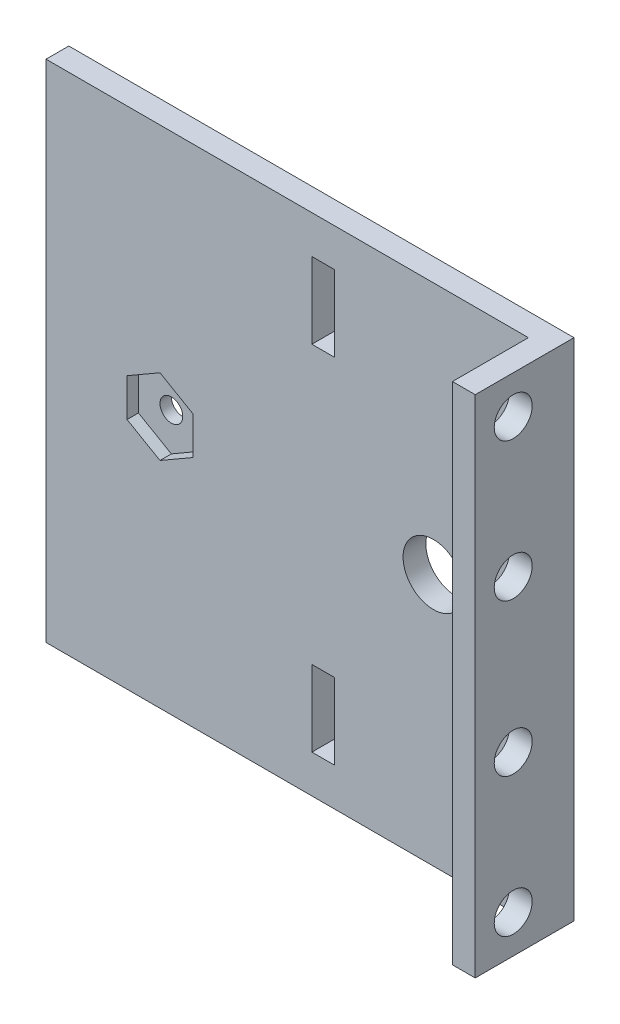
ISO-10303-21;
HEADER;
FILE_DESCRIPTION(('STEP AP214'),'2;1');
FILE_NAME('part.step','',(''),(''),'','','');
FILE_SCHEMA(('AUTOMOTIVE_DESIGN { 1 0 10303 214 1 1 1 1 }'));
ENDSEC;
DATA;
#1=APPLICATION_CONTEXT('core data for automotive mechanical design processes');
#2=APPLICATION_PROTOCOL_DEFINITION('international standard','automotive_design',2000,#1);
#3=PRODUCT_CONTEXT('',#1,'mechanical');
#4=PRODUCT('Part','Part','',(#3));
#5=PRODUCT_RELATED_PRODUCT_CATEGORY('part','',(#4));
#6=PRODUCT_DEFINITION_FORMATION('','',#4);
#7=PRODUCT_DEFINITION_CONTEXT('part definition',#1,'design');
#8=PRODUCT_DEFINITION('design','',#6,#7);
#9=PRODUCT_DEFINITION_SHAPE('','',#8);
#10=(LENGTH_UNIT() NAMED_UNIT(*) SI_UNIT(.MILLI.,.METRE.));
#11=(NAMED_UNIT(*) PLANE_ANGLE_UNIT() SI_UNIT($,.RADIAN.));
#12=(NAMED_UNIT(*) SI_UNIT($,.STERADIAN.) SOLID_ANGLE_UNIT());
#13=UNCERTAINTY_MEASURE_WITH_UNIT(LENGTH_MEASURE(1.E-05),#10,'distance_accuracy_value','');
#14=(GEOMETRIC_REPRESENTATION_CONTEXT(3) GLOBAL_UNCERTAINTY_ASSIGNED_CONTEXT((#13)) GLOBAL_UNIT_ASSIGNED_CONTEXT((#10,
#11,#12)) REPRESENTATION_CONTEXT('',''));
#15=CARTESIAN_POINT('',(0.,0.,0.));
#16=DIRECTION('',(0.,0.,1.));
#17=DIRECTION('',(1.,0.,0.));
#18=AXIS2_PLACEMENT_3D('',#15,#16,#17);
#19=CARTESIAN_POINT('',(0.,0.,3.));
#20=DIRECTION('',(0.,0.,1.));
#21=DIRECTION('',(1.,0.,0.));
#22=AXIS2_PLACEMENT_3D('',#19,#20,#21);
#23=PLANE('',#22);
#24=DIRECTION('',(0.,1.,0.));
#25=VECTOR('',#24,1.);
#26=CARTESIAN_POINT('',(1.75000000000002,28.25,3.));
#27=LINE('',#26,#25);
#28=CARTESIAN_POINT('',(1.75000000000001,18.25,3.));
#29=VERTEX_POINT('',#28);
#30=CARTESIAN_POINT('',(1.75000000000002,28.25,3.));
#31=VERTEX_POINT('',#30);
#32=EDGE_CURVE('E259',#29,#31,#27,.T.);
#33=ORIENTED_EDGE('',*,*,#32,.T.);
#34=DIRECTION('',(1.,0.,0.));
#35=VECTOR('',#34,1.);
#36=CARTESIAN_POINT('',(1.75000000000002,28.25,3.));
#37=LINE('',#36,#35);
#38=CARTESIAN_POINT('',(4.75000000000002,28.25,3.));
#39=VERTEX_POINT('',#38);
#40=EDGE_CURVE('E282',#31,#39,#37,.T.);
#41=ORIENTED_EDGE('',*,*,#40,.T.);
#42=DIRECTION('',(0.,-1.,0.));
#43=VECTOR('',#42,1.);
#44=CARTESIAN_POINT('',(4.75000000000002,28.25,3.));
#45=LINE('',#44,#43);
#46=CARTESIAN_POINT('',(4.75000000000002,18.25,3.));
#47=VERTEX_POINT('',#46);
#48=EDGE_CURVE('E251',#39,#47,#45,.T.);
#49=ORIENTED_EDGE('',*,*,#48,.T.);
#50=DIRECTION('',(-1.,0.,0.));
#51=VECTOR('',#50,1.);
#52=CARTESIAN_POINT('',(1.75000000000001,18.25,3.));
#53=LINE('',#52,#51);
#54=EDGE_CURVE('E255',#47,#29,#53,.T.);
#55=ORIENTED_EDGE('',*,*,#54,.T.);
#56=EDGE_LOOP('',(#33,#41,#49,#55));
#57=FACE_BOUND('',#56,.T.);
#58=DIRECTION('',(0.,-1.,0.));
#59=VECTOR('',#58,1.);
#60=CARTESIAN_POINT('',(30.25,-33.25,3.));
#61=LINE('',#60,#59);
#62=CARTESIAN_POINT('',(30.25,33.25,3.));
#63=VERTEX_POINT('',#62);
#64=CARTESIAN_POINT('',(30.25,-33.25,3.));
#65=VERTEX_POINT('',#64);
#66=EDGE_CURVE('E321',#63,#65,#61,.T.);
#67=ORIENTED_EDGE('',*,*,#66,.F.);
#68=DIRECTION('',(-1.,0.,0.));
#69=VECTOR('',#68,1.);
#70=CARTESIAN_POINT('',(-33.25,33.25,3.));
#71=LINE('',#70,#69);
#72=CARTESIAN_POINT('',(-33.25,33.25,3.));
#73=VERTEX_POINT('',#72);
#74=EDGE_CURVE('E362',#63,#73,#71,.T.);
#75=ORIENTED_EDGE('',*,*,#74,.T.);
#76=DIRECTION('',(0.,-1.,0.));
#77=VECTOR('',#76,1.);
#78=CARTESIAN_POINT('',(-33.25,33.25,3.));
#79=LINE('',#78,#77);
#80=CARTESIAN_POINT('',(-33.25,-33.25,3.));
#81=VERTEX_POINT('',#80);
#82=EDGE_CURVE('E365',#73,#81,#79,.T.);
#83=ORIENTED_EDGE('',*,*,#82,.T.);
#84=DIRECTION('',(1.,0.,0.));
#85=VECTOR('',#84,1.);
#86=CARTESIAN_POINT('',(-33.25,-33.25,3.));
#87=LINE('',#86,#85);
#88=EDGE_CURVE('E369',#81,#65,#87,.T.);
#89=ORIENTED_EDGE('',*,*,#88,.T.);
#90=EDGE_LOOP('',(#67,#75,#83,#89));
#91=FACE_BOUND('',#90,.T.);
#92=CARTESIAN_POINT('',(17.75,0.,3.));
#93=DIRECTION('',(0.,0.,1.));
#94=DIRECTION('',(1.,0.,0.));
#95=AXIS2_PLACEMENT_3D('',#92,#93,#94);
#96=CIRCLE('',#95,4.);
#97=CARTESIAN_POINT('',(21.75,0.,3.));
#98=VERTEX_POINT('',#97);
#99=EDGE_CURVE('E354',#98,#98,#96,.T.);
#100=ORIENTED_EDGE('',*,*,#99,.F.);
#101=EDGE_LOOP('',(#100));
#102=FACE_BOUND('',#101,.T.);
#103=DIRECTION('',(1.,0.,0.));
#104=VECTOR('',#103,1.);
#105=CARTESIAN_POINT('',(1.75000000000002,-28.25,3.));
#106=LINE('',#105,#104);
#107=CARTESIAN_POINT('',(1.75000000000002,-28.25,3.));
#108=VERTEX_POINT('',#107);
#109=CARTESIAN_POINT('',(4.75000000000002,-28.25,3.));
#110=VERTEX_POINT('',#109);
#111=EDGE_CURVE('E205',#108,#110,#106,.T.);
#112=ORIENTED_EDGE('',*,*,#111,.F.);
#113=DIRECTION('',(0.,-1.,0.));
#114=VECTOR('',#113,1.);
#115=CARTESIAN_POINT('',(1.75000000000002,-28.25,3.));
#116=LINE('',#115,#114);
#117=CARTESIAN_POINT('',(1.75000000000001,-18.25,3.));
#118=VERTEX_POINT('',#117);
#119=EDGE_CURVE('E214',#118,#108,#116,.T.);
#120=ORIENTED_EDGE('',*,*,#119,.F.);
#121=DIRECTION('',(-1.,0.,0.));
#122=VECTOR('',#121,1.);
#123=CARTESIAN_POINT('',(1.75000000000001,-18.25,3.));
#124=LINE('',#123,#122);
#125=CARTESIAN_POINT('',(4.75000000000002,-18.25,3.));
#126=VERTEX_POINT('',#125);
#127=EDGE_CURVE('E238',#126,#118,#124,.T.);
#128=ORIENTED_EDGE('',*,*,#127,.F.);
#129=DIRECTION('',(0.,1.,0.));
#130=VECTOR('',#129,1.);
#131=CARTESIAN_POINT('',(4.75000000000002,-28.25,3.));
#132=LINE('',#131,#130);
#133=EDGE_CURVE('E63',#110,#126,#132,.T.);
#134=ORIENTED_EDGE('',*,*,#133,.F.);
#135=EDGE_LOOP('',(#112,#120,#128,#134));
#136=FACE_BOUND('',#135,.T.);
#137=DIRECTION('',(0.,-1.,0.));
#138=VECTOR('',#137,1.);
#139=CARTESIAN_POINT('',(-13.9198729810778,2.5,3.));
#140=LINE('',#139,#138);
#141=CARTESIAN_POINT('',(-13.9198729810778,2.5,3.));
#142=VERTEX_POINT('',#141);
#143=CARTESIAN_POINT('',(-13.9198729810778,-2.5,3.));
#144=VERTEX_POINT('',#143);
#145=EDGE_CURVE('E195',#142,#144,#140,.T.);
#146=ORIENTED_EDGE('',*,*,#145,.T.);
#147=DIRECTION('',(-0.866025403784438,-0.5,0.));
#148=VECTOR('',#147,1.);
#149=CARTESIAN_POINT('',(-13.9198729810778,-2.5,3.));
#150=LINE('',#149,#148);
#151=CARTESIAN_POINT('',(-18.25,-5.,3.));
#152=VERTEX_POINT('',#151);
#153=EDGE_CURVE('E55',#144,#152,#150,.T.);
#154=ORIENTED_EDGE('',*,*,#153,.T.);
#155=DIRECTION('',(-0.866025403784438,0.5,0.));
#156=VECTOR('',#155,1.);
#157=CARTESIAN_POINT('',(-18.25,-5.,3.));
#158=LINE('',#157,#156);
#159=CARTESIAN_POINT('',(-22.5801270189222,-2.5,3.));
#160=VERTEX_POINT('',#159);
#161=EDGE_CURVE('E199',#152,#160,#158,.T.);
#162=ORIENTED_EDGE('',*,*,#161,.T.);
#163=DIRECTION('',(0.,1.,0.));
#164=VECTOR('',#163,1.);
#165=CARTESIAN_POINT('',(-22.5801270189222,-2.5,3.));
#166=LINE('',#165,#164);
#167=CARTESIAN_POINT('',(-22.5801270189222,2.5,3.));
#168=VERTEX_POINT('',#167);
#169=EDGE_CURVE('E488',#160,#168,#166,.T.);
#170=ORIENTED_EDGE('',*,*,#169,.T.);
#171=DIRECTION('',(0.866025403784439,0.5,0.));
#172=VECTOR('',#171,1.);
#173=CARTESIAN_POINT('',(-22.5801270189222,2.5,3.));
#174=LINE('',#173,#172);
#175=CARTESIAN_POINT('',(-18.25,5.,3.));
#176=VERTEX_POINT('',#175);
#177=EDGE_CURVE('E469',#168,#176,#174,.T.);
#178=ORIENTED_EDGE('',*,*,#177,.T.);
#179=DIRECTION('',(0.866025403784439,-0.5,0.));
#180=VECTOR('',#179,1.);
#181=CARTESIAN_POINT('',(-18.25,5.,3.));
#182=LINE('',#181,#180);
#183=EDGE_CURVE('E463',#176,#142,#182,.T.);
#184=ORIENTED_EDGE('',*,*,#183,.T.);
#185=EDGE_LOOP('',(#146,#154,#162,#170,#178,#184));
#186=FACE_BOUND('',#185,.T.);
#187=ADVANCED_FACE('F39',(#57,#91,#102,#136,#186),#23,.T.);
#188=CARTESIAN_POINT('',(0.,0.,0.));
#189=DIRECTION('',(0.,0.,1.));
#190=DIRECTION('',(1.,0.,0.));
#191=AXIS2_PLACEMENT_3D('',#188,#189,#190);
#192=PLANE('',#191);
#193=CARTESIAN_POINT('',(-18.25,0.,0.));
#194=DIRECTION('',(0.,0.,-1.));
#195=DIRECTION('',(-1.,0.,0.));
#196=AXIS2_PLACEMENT_3D('',#193,#194,#195);
#197=CIRCLE('',#196,1.5);
#198=CARTESIAN_POINT('',(-19.75,0.,0.));
#199=VERTEX_POINT('',#198);
#200=EDGE_CURVE('E514',#199,#199,#197,.T.);
#201=ORIENTED_EDGE('',*,*,#200,.F.);
#202=EDGE_LOOP('',(#201));
#203=FACE_BOUND('',#202,.T.);
#204=CARTESIAN_POINT('',(17.75,0.,0.));
#205=DIRECTION('',(0.,0.,1.));
#206=DIRECTION('',(1.,0.,0.));
#207=AXIS2_PLACEMENT_3D('',#204,#205,#206);
#208=CIRCLE('',#207,4.);
#209=CARTESIAN_POINT('',(21.75,0.,0.));
#210=VERTEX_POINT('',#209);
#211=EDGE_CURVE('E353',#210,#210,#208,.T.);
#212=ORIENTED_EDGE('',*,*,#211,.T.);
#213=EDGE_LOOP('',(#212));
#214=FACE_BOUND('',#213,.T.);
#215=DIRECTION('',(0.,1.,0.));
#216=VECTOR('',#215,1.);
#217=CARTESIAN_POINT('',(33.25,33.25,0.));
#218=LINE('',#217,#216);
#219=CARTESIAN_POINT('',(33.25,-33.25,0.));
#220=VERTEX_POINT('',#219);
#221=CARTESIAN_POINT('',(33.25,33.25,0.));
#222=VERTEX_POINT('',#221);
#223=EDGE_CURVE('E358',#220,#222,#218,.T.);
#224=ORIENTED_EDGE('',*,*,#223,.F.);
#225=DIRECTION('',(1.,0.,0.));
#226=VECTOR('',#225,1.);
#227=CARTESIAN_POINT('',(-33.25,-33.25,0.));
#228=LINE('',#227,#226);
#229=CARTESIAN_POINT('',(-33.25,-33.25,0.));
#230=VERTEX_POINT('',#229);
#231=EDGE_CURVE('E366',#230,#220,#228,.T.);
#232=ORIENTED_EDGE('',*,*,#231,.F.);
#233=DIRECTION('',(0.,-1.,0.));
#234=VECTOR('',#233,1.);
#235=CARTESIAN_POINT('',(-33.25,33.25,0.));
#236=LINE('',#235,#234);
#237=CARTESIAN_POINT('',(-33.25,33.25,0.));
#238=VERTEX_POINT('',#237);
#239=EDGE_CURVE('E379',#238,#230,#236,.T.);
#240=ORIENTED_EDGE('',*,*,#239,.F.);
#241=DIRECTION('',(-1.,0.,0.));
#242=VECTOR('',#241,1.);
#243=CARTESIAN_POINT('',(-33.25,33.25,0.));
#244=LINE('',#243,#242);
#245=EDGE_CURVE('E376',#222,#238,#244,.T.);
#246=ORIENTED_EDGE('',*,*,#245,.F.);
#247=EDGE_LOOP('',(#224,#232,#240,#246));
#248=FACE_BOUND('',#247,.T.);
#249=DIRECTION('',(1.,0.,0.));
#250=VECTOR('',#249,1.);
#251=CARTESIAN_POINT('',(1.75000000000002,28.25,0.));
#252=LINE('',#251,#250);
#253=CARTESIAN_POINT('',(1.75000000000002,28.25,0.));
#254=VERTEX_POINT('',#253);
#255=CARTESIAN_POINT('',(4.75000000000002,28.25,0.));
#256=VERTEX_POINT('',#255);
#257=EDGE_CURVE('E266',#254,#256,#252,.T.);
#258=ORIENTED_EDGE('',*,*,#257,.F.);
#259=DIRECTION('',(0.,1.,0.));
#260=VECTOR('',#259,1.);
#261=CARTESIAN_POINT('',(1.75000000000002,28.25,0.));
#262=LINE('',#261,#260);
#263=CARTESIAN_POINT('',(1.75000000000001,18.25,0.));
#264=VERTEX_POINT('',#263);
#265=EDGE_CURVE('E263',#264,#254,#262,.T.);
#266=ORIENTED_EDGE('',*,*,#265,.F.);
#267=DIRECTION('',(-1.,0.,0.));
#268=VECTOR('',#267,1.);
#269=CARTESIAN_POINT('',(1.75000000000001,18.25,0.));
#270=LINE('',#269,#268);
#271=CARTESIAN_POINT('',(4.75000000000002,18.25,0.));
#272=VERTEX_POINT('',#271);
#273=EDGE_CURVE('E274',#272,#264,#270,.T.);
#274=ORIENTED_EDGE('',*,*,#273,.F.);
#275=DIRECTION('',(0.,-1.,0.));
#276=VECTOR('',#275,1.);
#277=CARTESIAN_POINT('',(4.75000000000002,28.25,0.));
#278=LINE('',#277,#276);
#279=EDGE_CURVE('E270',#256,#272,#278,.T.);
#280=ORIENTED_EDGE('',*,*,#279,.F.);
#281=EDGE_LOOP('',(#258,#266,#274,#280));
#282=FACE_BOUND('',#281,.T.);
#283=DIRECTION('',(0.,-1.,0.));
#284=VECTOR('',#283,1.);
#285=CARTESIAN_POINT('',(1.75000000000002,-28.25,0.));
#286=LINE('',#285,#284);
#287=CARTESIAN_POINT('',(1.75000000000001,-18.25,0.));
#288=VERTEX_POINT('',#287);
#289=CARTESIAN_POINT('',(1.75000000000002,-28.25,0.));
#290=VERTEX_POINT('',#289);
#291=EDGE_CURVE('E218',#288,#290,#286,.T.);
#292=ORIENTED_EDGE('',*,*,#291,.T.);
#293=DIRECTION('',(1.,0.,0.));
#294=VECTOR('',#293,1.);
#295=CARTESIAN_POINT('',(1.75000000000002,-28.25,0.));
#296=LINE('',#295,#294);
#297=CARTESIAN_POINT('',(4.75000000000002,-28.25,0.));
#298=VERTEX_POINT('',#297);
#299=EDGE_CURVE('E230',#290,#298,#296,.T.);
#300=ORIENTED_EDGE('',*,*,#299,.T.);
#301=DIRECTION('',(0.,1.,0.));
#302=VECTOR('',#301,1.);
#303=CARTESIAN_POINT('',(4.75000000000002,-28.25,0.));
#304=LINE('',#303,#302);
#305=CARTESIAN_POINT('',(4.75000000000002,-18.25,0.));
#306=VERTEX_POINT('',#305);
#307=EDGE_CURVE('E226',#298,#306,#304,.T.);
#308=ORIENTED_EDGE('',*,*,#307,.T.);
#309=DIRECTION('',(-1.,0.,0.));
#310=VECTOR('',#309,1.);
#311=CARTESIAN_POINT('',(1.75000000000001,-18.25,0.));
#312=LINE('',#311,#310);
#313=EDGE_CURVE('E222',#306,#288,#312,.T.);
#314=ORIENTED_EDGE('',*,*,#313,.T.);
#315=EDGE_LOOP('',(#292,#300,#308,#314));
#316=FACE_BOUND('',#315,.T.);
#317=ADVANCED_FACE('F403',(#203,#214,#248,#282,#316),#192,.F.);
#318=CARTESIAN_POINT('',(33.25,33.25,3.));
#319=DIRECTION('',(-1.,0.,0.));
#320=DIRECTION('',(0.,-1.,0.));
#321=AXIS2_PLACEMENT_3D('',#318,#319,#320);
#322=PLANE('',#321);
#323=CARTESIAN_POINT('',(33.25,28.25,8.));
#324=DIRECTION('',(-1.,0.,0.));
#325=DIRECTION('',(0.,-1.,0.));
#326=AXIS2_PLACEMENT_3D('',#323,#324,#325);
#327=CIRCLE('',#326,2.5);
#328=CARTESIAN_POINT('',(33.25,25.75,8.));
#329=VERTEX_POINT('',#328);
#330=EDGE_CURVE('E296',#329,#329,#327,.T.);
#331=ORIENTED_EDGE('',*,*,#330,.T.);
#332=EDGE_LOOP('',(#331));
#333=FACE_BOUND('',#332,.T.);
#334=CARTESIAN_POINT('',(33.25,9.99999999999999,8.));
#335=DIRECTION('',(-1.,0.,0.));
#336=DIRECTION('',(0.,-1.,0.));
#337=AXIS2_PLACEMENT_3D('',#334,#335,#336);
#338=CIRCLE('',#337,2.5);
#339=CARTESIAN_POINT('',(33.25,7.49999999999999,8.));
#340=VERTEX_POINT('',#339);
#341=EDGE_CURVE('E305',#340,#340,#338,.T.);
#342=ORIENTED_EDGE('',*,*,#341,.T.);
#343=EDGE_LOOP('',(#342));
#344=FACE_BOUND('',#343,.T.);
#345=CARTESIAN_POINT('',(33.25,-28.25,8.));
#346=DIRECTION('',(1.,0.,0.));
#347=DIRECTION('',(0.,1.,0.));
#348=AXIS2_PLACEMENT_3D('',#345,#346,#347);
#349=CIRCLE('',#348,2.5);
#350=CARTESIAN_POINT('',(33.25,-25.75,8.));
#351=VERTEX_POINT('',#350);
#352=EDGE_CURVE('E312',#351,#351,#349,.T.);
#353=ORIENTED_EDGE('',*,*,#352,.F.);
#354=EDGE_LOOP('',(#353));
#355=FACE_BOUND('',#354,.T.);
#356=CARTESIAN_POINT('',(33.25,-9.99999999999999,8.));
#357=DIRECTION('',(1.,0.,0.));
#358=DIRECTION('',(0.,1.,0.));
#359=AXIS2_PLACEMENT_3D('',#356,#357,#358);
#360=CIRCLE('',#359,2.5);
#361=CARTESIAN_POINT('',(33.25,-7.49999999999999,8.));
#362=VERTEX_POINT('',#361);
#363=EDGE_CURVE('E300',#362,#362,#360,.T.);
#364=ORIENTED_EDGE('',*,*,#363,.F.);
#365=EDGE_LOOP('',(#364));
#366=FACE_BOUND('',#365,.T.);
#367=ORIENTED_EDGE('',*,*,#223,.T.);
#368=DIRECTION('',(0.,0.,-1.));
#369=VECTOR('',#368,1.);
#370=CARTESIAN_POINT('',(33.25,33.25,3.));
#371=LINE('',#370,#369);
#372=CARTESIAN_POINT('',(33.25,33.25,13.));
#373=VERTEX_POINT('',#372);
#374=EDGE_CURVE('E11',#373,#222,#371,.T.);
#375=ORIENTED_EDGE('',*,*,#374,.F.);
#376=DIRECTION('',(0.,1.,0.));
#377=VECTOR('',#376,1.);
#378=CARTESIAN_POINT('',(33.25,-33.25,13.));
#379=LINE('',#378,#377);
#380=CARTESIAN_POINT('',(33.25,-33.25,13.));
#381=VERTEX_POINT('',#380);
#382=EDGE_CURVE('E328',#381,#373,#379,.T.);
#383=ORIENTED_EDGE('',*,*,#382,.F.);
#384=DIRECTION('',(0.,0.,-1.));
#385=VECTOR('',#384,1.);
#386=CARTESIAN_POINT('',(33.25,-33.25,3.));
#387=LINE('',#386,#385);
#388=EDGE_CURVE('E372',#381,#220,#387,.T.);
#389=ORIENTED_EDGE('',*,*,#388,.T.);
#390=EDGE_LOOP('',(#367,#375,#383,#389));
#391=FACE_BOUND('',#390,.T.);
#392=ADVANCED_FACE('F41',(#333,#344,#355,#366,#391),#322,.F.);
#393=CARTESIAN_POINT('',(-33.25,33.25,3.));
#394=DIRECTION('',(0.,-1.,0.));
#395=DIRECTION('',(0.,0.,-1.));
#396=AXIS2_PLACEMENT_3D('',#393,#394,#395);
#397=PLANE('',#396);
#398=ORIENTED_EDGE('',*,*,#245,.T.);
#399=DIRECTION('',(0.,0.,-1.));
#400=VECTOR('',#399,1.);
#401=CARTESIAN_POINT('',(-33.25,33.25,3.));
#402=LINE('',#401,#400);
#403=EDGE_CURVE('E48',#73,#238,#402,.T.);
#404=ORIENTED_EDGE('',*,*,#403,.F.);
#405=ORIENTED_EDGE('',*,*,#74,.F.);
#406=DIRECTION('',(0.,0.,-1.));
#407=VECTOR('',#406,1.);
#408=CARTESIAN_POINT('',(30.25,33.25,13.));
#409=LINE('',#408,#407);
#410=CARTESIAN_POINT('',(30.25,33.25,13.));
#411=VERTEX_POINT('',#410);
#412=EDGE_CURVE('E349',#411,#63,#409,.T.);
#413=ORIENTED_EDGE('',*,*,#412,.F.);
#414=DIRECTION('',(-1.,0.,0.));
#415=VECTOR('',#414,1.);
#416=CARTESIAN_POINT('',(33.25,33.25,13.));
#417=LINE('',#416,#415);
#418=EDGE_CURVE('E332',#373,#411,#417,.T.);
#419=ORIENTED_EDGE('',*,*,#418,.F.);
#420=ORIENTED_EDGE('',*,*,#374,.T.);
#421=EDGE_LOOP('',(#398,#404,#405,#413,#419,#420));
#422=FACE_BOUND('',#421,.T.);
#423=ADVANCED_FACE('F421',(#422),#397,.F.);
#424=CARTESIAN_POINT('',(-33.25,33.25,3.));
#425=DIRECTION('',(1.,0.,0.));
#426=DIRECTION('',(0.,1.,0.));
#427=AXIS2_PLACEMENT_3D('',#424,#425,#426);
#428=PLANE('',#427);
#429=ORIENTED_EDGE('',*,*,#239,.T.);
#430=DIRECTION('',(0.,0.,-1.));
#431=VECTOR('',#430,1.);
#432=CARTESIAN_POINT('',(-33.25,-33.25,3.));
#433=LINE('',#432,#431);
#434=EDGE_CURVE('E387',#81,#230,#433,.T.);
#435=ORIENTED_EDGE('',*,*,#434,.F.);
#436=ORIENTED_EDGE('',*,*,#82,.F.);
#437=ORIENTED_EDGE('',*,*,#403,.T.);
#438=EDGE_LOOP('',(#429,#435,#436,#437));
#439=FACE_BOUND('',#438,.T.);
#440=ADVANCED_FACE('F396',(#439),#428,.F.);
#441=CARTESIAN_POINT('',(-33.25,-33.25,3.));
#442=DIRECTION('',(0.,1.,0.));
#443=DIRECTION('',(0.,0.,1.));
#444=AXIS2_PLACEMENT_3D('',#441,#442,#443);
#445=PLANE('',#444);
#446=ORIENTED_EDGE('',*,*,#231,.T.);
#447=ORIENTED_EDGE('',*,*,#388,.F.);
#448=DIRECTION('',(1.,0.,0.));
#449=VECTOR('',#448,1.);
#450=CARTESIAN_POINT('',(33.25,-33.25,13.));
#451=LINE('',#450,#449);
#452=CARTESIAN_POINT('',(30.25,-33.25,13.));
#453=VERTEX_POINT('',#452);
#454=EDGE_CURVE('E338',#453,#381,#451,.T.);
#455=ORIENTED_EDGE('',*,*,#454,.F.);
#456=DIRECTION('',(0.,0.,-1.));
#457=VECTOR('',#456,1.);
#458=CARTESIAN_POINT('',(30.25,-33.25,13.));
#459=LINE('',#458,#457);
#460=EDGE_CURVE('E342',#453,#65,#459,.T.);
#461=ORIENTED_EDGE('',*,*,#460,.T.);
#462=ORIENTED_EDGE('',*,*,#88,.F.);
#463=ORIENTED_EDGE('',*,*,#434,.T.);
#464=EDGE_LOOP('',(#446,#447,#455,#461,#462,#463));
#465=FACE_BOUND('',#464,.T.);
#466=ADVANCED_FACE('F406',(#465),#445,.F.);
#467=CARTESIAN_POINT('',(17.75,0.,3.));
#468=DIRECTION('',(0.,0.,-1.));
#469=DIRECTION('',(-1.,0.,0.));
#470=AXIS2_PLACEMENT_3D('',#467,#468,#469);
#471=CYLINDRICAL_SURFACE('',#470,4.);
#472=ORIENTED_EDGE('',*,*,#99,.T.);
#473=EDGE_LOOP('',(#472));
#474=FACE_BOUND('',#473,.T.);
#475=ORIENTED_EDGE('',*,*,#211,.F.);
#476=EDGE_LOOP('',(#475));
#477=FACE_BOUND('',#476,.T.);
#478=ADVANCED_FACE('F438',(#474,#477),#471,.F.);
#479=CARTESIAN_POINT('',(30.25,-33.25,13.));
#480=DIRECTION('',(1.,0.,0.));
#481=DIRECTION('',(0.,0.,-1.));
#482=AXIS2_PLACEMENT_3D('',#479,#480,#481);
#483=PLANE('',#482);
#484=CARTESIAN_POINT('',(30.25,28.25,8.));
#485=DIRECTION('',(1.,0.,0.));
#486=DIRECTION('',(0.,0.,-1.));
#487=AXIS2_PLACEMENT_3D('',#484,#485,#486);
#488=CIRCLE('',#487,2.5);
#489=CARTESIAN_POINT('',(30.25,28.25,5.5));
#490=VERTEX_POINT('',#489);
#491=EDGE_CURVE('E301',#490,#490,#488,.T.);
#492=ORIENTED_EDGE('',*,*,#491,.T.);
#493=EDGE_LOOP('',(#492));
#494=FACE_BOUND('',#493,.T.);
#495=CARTESIAN_POINT('',(30.25,9.99999999999999,8.));
#496=DIRECTION('',(1.,0.,0.));
#497=DIRECTION('',(0.,0.,-1.));
#498=AXIS2_PLACEMENT_3D('',#495,#496,#497);
#499=CIRCLE('',#498,2.5);
#500=CARTESIAN_POINT('',(30.25,9.99999999999999,5.5));
#501=VERTEX_POINT('',#500);
#502=EDGE_CURVE('E295',#501,#501,#499,.T.);
#503=ORIENTED_EDGE('',*,*,#502,.T.);
#504=EDGE_LOOP('',(#503));
#505=FACE_BOUND('',#504,.T.);
#506=CARTESIAN_POINT('',(30.25,-28.25,8.));
#507=DIRECTION('',(1.,0.,0.));
#508=DIRECTION('',(0.,0.,-1.));
#509=AXIS2_PLACEMENT_3D('',#506,#507,#508);
#510=CIRCLE('',#509,2.5);
#511=CARTESIAN_POINT('',(30.25,-28.25,5.5));
#512=VERTEX_POINT('',#511);
#513=EDGE_CURVE('E316',#512,#512,#510,.F.);
#514=ORIENTED_EDGE('',*,*,#513,.F.);
#515=EDGE_LOOP('',(#514));
#516=FACE_BOUND('',#515,.T.);
#517=CARTESIAN_POINT('',(30.25,-9.99999999999999,8.));
#518=DIRECTION('',(1.,0.,0.));
#519=DIRECTION('',(0.,0.,-1.));
#520=AXIS2_PLACEMENT_3D('',#517,#518,#519);
#521=CIRCLE('',#520,2.5);
#522=CARTESIAN_POINT('',(30.25,-9.99999999999999,5.5));
#523=VERTEX_POINT('',#522);
#524=EDGE_CURVE('E317',#523,#523,#521,.F.);
#525=ORIENTED_EDGE('',*,*,#524,.F.);
#526=EDGE_LOOP('',(#525));
#527=FACE_BOUND('',#526,.T.);
#528=ORIENTED_EDGE('',*,*,#66,.T.);
#529=ORIENTED_EDGE('',*,*,#460,.F.);
#530=DIRECTION('',(0.,-1.,0.));
#531=VECTOR('',#530,1.);
#532=CARTESIAN_POINT('',(30.25,-33.25,13.));
#533=LINE('',#532,#531);
#534=EDGE_CURVE('E335',#411,#453,#533,.T.);
#535=ORIENTED_EDGE('',*,*,#534,.F.);
#536=ORIENTED_EDGE('',*,*,#412,.T.);
#537=EDGE_LOOP('',(#528,#529,#535,#536));
#538=FACE_BOUND('',#537,.T.);
#539=ADVANCED_FACE('F418',(#494,#505,#516,#527,#538),#483,.F.);
#540=CARTESIAN_POINT('',(0.,0.,13.));
#541=DIRECTION('',(0.,0.,1.));
#542=DIRECTION('',(1.,0.,0.));
#543=AXIS2_PLACEMENT_3D('',#540,#541,#542);
#544=PLANE('',#543);
#545=ORIENTED_EDGE('',*,*,#382,.T.);
#546=ORIENTED_EDGE('',*,*,#418,.T.);
#547=ORIENTED_EDGE('',*,*,#534,.T.);
#548=ORIENTED_EDGE('',*,*,#454,.T.);
#549=EDGE_LOOP('',(#545,#546,#547,#548));
#550=FACE_BOUND('',#549,.T.);
#551=ADVANCED_FACE('F413',(#550),#544,.T.);
#552=CARTESIAN_POINT('',(-33.251,-10.,8.));
#553=DIRECTION('',(1.,0.,0.));
#554=DIRECTION('',(0.,1.,0.));
#555=AXIS2_PLACEMENT_3D('',#552,#553,#554);
#556=CYLINDRICAL_SURFACE('',#555,2.5);
#557=ORIENTED_EDGE('',*,*,#363,.T.);
#558=EDGE_LOOP('',(#557));
#559=FACE_BOUND('',#558,.T.);
#560=ORIENTED_EDGE('',*,*,#524,.T.);
#561=EDGE_LOOP('',(#560));
#562=FACE_BOUND('',#561,.T.);
#563=ADVANCED_FACE('F587',(#559,#562),#556,.F.);
#564=CARTESIAN_POINT('',(-33.251,-28.25,8.));
#565=DIRECTION('',(1.,0.,0.));
#566=DIRECTION('',(0.,1.,0.));
#567=AXIS2_PLACEMENT_3D('',#564,#565,#566);
#568=CYLINDRICAL_SURFACE('',#567,2.5);
#569=ORIENTED_EDGE('',*,*,#352,.T.);
#570=EDGE_LOOP('',(#569));
#571=FACE_BOUND('',#570,.T.);
#572=ORIENTED_EDGE('',*,*,#513,.T.);
#573=EDGE_LOOP('',(#572));
#574=FACE_BOUND('',#573,.T.);
#575=ADVANCED_FACE('F583',(#571,#574),#568,.F.);
#576=CARTESIAN_POINT('',(-33.251,10.,8.));
#577=DIRECTION('',(1.,0.,0.));
#578=DIRECTION('',(0.,1.,0.));
#579=AXIS2_PLACEMENT_3D('',#576,#577,#578);
#580=CYLINDRICAL_SURFACE('',#579,2.5);
#581=ORIENTED_EDGE('',*,*,#341,.F.);
#582=EDGE_LOOP('',(#581));
#583=FACE_BOUND('',#582,.T.);
#584=ORIENTED_EDGE('',*,*,#502,.F.);
#585=EDGE_LOOP('',(#584));
#586=FACE_BOUND('',#585,.T.);
#587=ADVANCED_FACE('F579',(#583,#586),#580,.F.);
#588=CARTESIAN_POINT('',(-33.251,28.25,8.));
#589=DIRECTION('',(1.,0.,0.));
#590=DIRECTION('',(0.,1.,0.));
#591=AXIS2_PLACEMENT_3D('',#588,#589,#590);
#592=CYLINDRICAL_SURFACE('',#591,2.5);
#593=ORIENTED_EDGE('',*,*,#330,.F.);
#594=EDGE_LOOP('',(#593));
#595=FACE_BOUND('',#594,.T.);
#596=ORIENTED_EDGE('',*,*,#491,.F.);
#597=EDGE_LOOP('',(#596));
#598=FACE_BOUND('',#597,.T.);
#599=ADVANCED_FACE('F575',(#595,#598),#592,.F.);
#600=CARTESIAN_POINT('',(1.75000000000002,28.25,13.001));
#601=DIRECTION('',(-1.,0.,0.));
#602=DIRECTION('',(0.,-1.,0.));
#603=AXIS2_PLACEMENT_3D('',#600,#601,#602);
#604=PLANE('',#603);
#605=DIRECTION('',(0.,0.,-1.));
#606=VECTOR('',#605,1.);
#607=CARTESIAN_POINT('',(1.75000000000001,18.25,13.001));
#608=LINE('',#607,#606);
#609=EDGE_CURVE('E279',#29,#264,#608,.T.);
#610=ORIENTED_EDGE('',*,*,#609,.T.);
#611=ORIENTED_EDGE('',*,*,#265,.T.);
#612=DIRECTION('',(0.,0.,-1.));
#613=VECTOR('',#612,1.);
#614=CARTESIAN_POINT('',(1.75000000000002,28.25,13.001));
#615=LINE('',#614,#613);
#616=EDGE_CURVE('E278',#31,#254,#615,.T.);
#617=ORIENTED_EDGE('',*,*,#616,.F.);
#618=ORIENTED_EDGE('',*,*,#32,.F.);
#619=EDGE_LOOP('',(#610,#611,#617,#618));
#620=FACE_BOUND('',#619,.T.);
#621=ADVANCED_FACE('F565',(#620),#604,.F.);
#622=CARTESIAN_POINT('',(1.75000000000001,18.25,13.001));
#623=DIRECTION('',(0.,-1.,0.));
#624=DIRECTION('',(0.,0.,-1.));
#625=AXIS2_PLACEMENT_3D('',#622,#623,#624);
#626=PLANE('',#625);
#627=DIRECTION('',(0.,0.,-1.));
#628=VECTOR('',#627,1.);
#629=CARTESIAN_POINT('',(4.75000000000002,18.25,13.001));
#630=LINE('',#629,#628);
#631=EDGE_CURVE('E283',#47,#272,#630,.T.);
#632=ORIENTED_EDGE('',*,*,#631,.T.);
#633=ORIENTED_EDGE('',*,*,#273,.T.);
#634=ORIENTED_EDGE('',*,*,#609,.F.);
#635=ORIENTED_EDGE('',*,*,#54,.F.);
#636=EDGE_LOOP('',(#632,#633,#634,#635));
#637=FACE_BOUND('',#636,.T.);
#638=ADVANCED_FACE('F561',(#637),#626,.F.);
#639=CARTESIAN_POINT('',(4.75000000000002,28.25,13.001));
#640=DIRECTION('',(1.,0.,0.));
#641=DIRECTION('',(0.,0.,-1.));
#642=AXIS2_PLACEMENT_3D('',#639,#640,#641);
#643=PLANE('',#642);
#644=DIRECTION('',(0.,0.,-1.));
#645=VECTOR('',#644,1.);
#646=CARTESIAN_POINT('',(4.75000000000002,28.25,13.001));
#647=LINE('',#646,#645);
#648=EDGE_CURVE('E286',#39,#256,#647,.T.);
#649=ORIENTED_EDGE('',*,*,#648,.T.);
#650=ORIENTED_EDGE('',*,*,#279,.T.);
#651=ORIENTED_EDGE('',*,*,#631,.F.);
#652=ORIENTED_EDGE('',*,*,#48,.F.);
#653=EDGE_LOOP('',(#649,#650,#651,#652));
#654=FACE_BOUND('',#653,.T.);
#655=ADVANCED_FACE('F564',(#654),#643,.F.);
#656=CARTESIAN_POINT('',(1.75000000000002,28.25,13.001));
#657=DIRECTION('',(0.,1.,0.));
#658=DIRECTION('',(0.,0.,1.));
#659=AXIS2_PLACEMENT_3D('',#656,#657,#658);
#660=PLANE('',#659);
#661=ORIENTED_EDGE('',*,*,#616,.T.);
#662=ORIENTED_EDGE('',*,*,#257,.T.);
#663=ORIENTED_EDGE('',*,*,#648,.F.);
#664=ORIENTED_EDGE('',*,*,#40,.F.);
#665=EDGE_LOOP('',(#661,#662,#663,#664));
#666=FACE_BOUND('',#665,.T.);
#667=ADVANCED_FACE('F559',(#666),#660,.F.);
#668=CARTESIAN_POINT('',(1.75000000000002,-28.25,13.001));
#669=DIRECTION('',(1.,0.,0.));
#670=DIRECTION('',(0.,1.,0.));
#671=AXIS2_PLACEMENT_3D('',#668,#669,#670);
#672=PLANE('',#671);
#673=ORIENTED_EDGE('',*,*,#119,.T.);
#674=DIRECTION('',(0.,0.,-1.));
#675=VECTOR('',#674,1.);
#676=CARTESIAN_POINT('',(1.75000000000002,-28.25,13.001));
#677=LINE('',#676,#675);
#678=EDGE_CURVE('E235',#108,#290,#677,.T.);
#679=ORIENTED_EDGE('',*,*,#678,.T.);
#680=ORIENTED_EDGE('',*,*,#291,.F.);
#681=DIRECTION('',(0.,0.,-1.));
#682=VECTOR('',#681,1.);
#683=CARTESIAN_POINT('',(1.75000000000001,-18.25,13.001));
#684=LINE('',#683,#682);
#685=EDGE_CURVE('E234',#118,#288,#684,.T.);
#686=ORIENTED_EDGE('',*,*,#685,.F.);
#687=EDGE_LOOP('',(#673,#679,#680,#686));
#688=FACE_BOUND('',#687,.T.);
#689=ADVANCED_FACE('F550',(#688),#672,.T.);
#690=CARTESIAN_POINT('',(1.75000000000002,-28.25,13.001));
#691=DIRECTION('',(0.,1.,0.));
#692=DIRECTION('',(0.,0.,1.));
#693=AXIS2_PLACEMENT_3D('',#690,#691,#692);
#694=PLANE('',#693);
#695=ORIENTED_EDGE('',*,*,#111,.T.);
#696=DIRECTION('',(0.,0.,-1.));
#697=VECTOR('',#696,1.);
#698=CARTESIAN_POINT('',(4.75000000000002,-28.25,13.001));
#699=LINE('',#698,#697);
#700=EDGE_CURVE('E239',#110,#298,#699,.T.);
#701=ORIENTED_EDGE('',*,*,#700,.T.);
#702=ORIENTED_EDGE('',*,*,#299,.F.);
#703=ORIENTED_EDGE('',*,*,#678,.F.);
#704=EDGE_LOOP('',(#695,#701,#702,#703));
#705=FACE_BOUND('',#704,.T.);
#706=ADVANCED_FACE('F546',(#705),#694,.T.);
#707=CARTESIAN_POINT('',(4.75000000000002,-28.25,13.001));
#708=DIRECTION('',(-1.,0.,0.));
#709=DIRECTION('',(0.,0.,1.));
#710=AXIS2_PLACEMENT_3D('',#707,#708,#709);
#711=PLANE('',#710);
#712=ORIENTED_EDGE('',*,*,#133,.T.);
#713=DIRECTION('',(0.,0.,-1.));
#714=VECTOR('',#713,1.);
#715=CARTESIAN_POINT('',(4.75000000000002,-18.25,13.001));
#716=LINE('',#715,#714);
#717=EDGE_CURVE('E242',#126,#306,#716,.T.);
#718=ORIENTED_EDGE('',*,*,#717,.T.);
#719=ORIENTED_EDGE('',*,*,#307,.F.);
#720=ORIENTED_EDGE('',*,*,#700,.F.);
#721=EDGE_LOOP('',(#712,#718,#719,#720));
#722=FACE_BOUND('',#721,.T.);
#723=ADVANCED_FACE('F549',(#722),#711,.T.);
#724=CARTESIAN_POINT('',(1.75000000000001,-18.25,13.001));
#725=DIRECTION('',(0.,-1.,0.));
#726=DIRECTION('',(0.,0.,-1.));
#727=AXIS2_PLACEMENT_3D('',#724,#725,#726);
#728=PLANE('',#727);
#729=ORIENTED_EDGE('',*,*,#127,.T.);
#730=ORIENTED_EDGE('',*,*,#685,.T.);
#731=ORIENTED_EDGE('',*,*,#313,.F.);
#732=ORIENTED_EDGE('',*,*,#717,.F.);
#733=EDGE_LOOP('',(#729,#730,#731,#732));
#734=FACE_BOUND('',#733,.T.);
#735=ADVANCED_FACE('F545',(#734),#728,.T.);
#736=CARTESIAN_POINT('',(-13.9198729810778,-2.5,1.5));
#737=DIRECTION('',(-0.5,0.866025403784438,0.));
#738=DIRECTION('',(-0.866025403784439,-0.5,0.));
#739=AXIS2_PLACEMENT_3D('',#736,#737,#738);
#740=PLANE('',#739);
#741=ORIENTED_EDGE('',*,*,#153,.F.);
#742=DIRECTION('',(0.,0.,1.));
#743=VECTOR('',#742,1.);
#744=CARTESIAN_POINT('',(-13.9198729810778,-2.5,1.5));
#745=LINE('',#744,#743);
#746=CARTESIAN_POINT('',(-13.9198729810778,-2.5,1.5));
#747=VERTEX_POINT('',#746);
#748=EDGE_CURVE('E193',#747,#144,#745,.T.);
#749=ORIENTED_EDGE('',*,*,#748,.F.);
#750=DIRECTION('',(-0.866025403784438,-0.5,0.));
#751=VECTOR('',#750,1.);
#752=CARTESIAN_POINT('',(-13.9198729810778,-2.5,1.5));
#753=LINE('',#752,#751);
#754=CARTESIAN_POINT('',(-18.25,-5.,1.5));
#755=VERTEX_POINT('',#754);
#756=EDGE_CURVE('E183',#747,#755,#753,.T.);
#757=ORIENTED_EDGE('',*,*,#756,.T.);
#758=DIRECTION('',(0.,0.,1.));
#759=VECTOR('',#758,1.);
#760=CARTESIAN_POINT('',(-18.25,-5.,1.5));
#761=LINE('',#760,#759);
#762=EDGE_CURVE('E192',#755,#152,#761,.T.);
#763=ORIENTED_EDGE('',*,*,#762,.T.);
#764=EDGE_LOOP('',(#741,#749,#757,#763));
#765=FACE_BOUND('',#764,.T.);
#766=ADVANCED_FACE('F191',(#765),#740,.T.);
#767=CARTESIAN_POINT('',(-18.25,-5.,1.5));
#768=DIRECTION('',(0.5,0.866025403784439,0.));
#769=DIRECTION('',(-0.866025403784439,0.5,0.));
#770=AXIS2_PLACEMENT_3D('',#767,#768,#769);
#771=PLANE('',#770);
#772=ORIENTED_EDGE('',*,*,#161,.F.);
#773=ORIENTED_EDGE('',*,*,#762,.F.);
#774=DIRECTION('',(-0.866025403784438,0.5,0.));
#775=VECTOR('',#774,1.);
#776=CARTESIAN_POINT('',(-18.25,-5.,1.5));
#777=LINE('',#776,#775);
#778=CARTESIAN_POINT('',(-22.5801270189222,-2.5,1.5));
#779=VERTEX_POINT('',#778);
#780=EDGE_CURVE('E179',#755,#779,#777,.T.);
#781=ORIENTED_EDGE('',*,*,#780,.T.);
#782=DIRECTION('',(0.,0.,1.));
#783=VECTOR('',#782,1.);
#784=CARTESIAN_POINT('',(-22.5801270189222,-2.5,1.5));
#785=LINE('',#784,#783);
#786=EDGE_CURVE('E201',#779,#160,#785,.T.);
#787=ORIENTED_EDGE('',*,*,#786,.T.);
#788=EDGE_LOOP('',(#772,#773,#781,#787));
#789=FACE_BOUND('',#788,.T.);
#790=ADVANCED_FACE('F197',(#789),#771,.T.);
#791=CARTESIAN_POINT('',(-22.5801270189222,-2.5,1.5));
#792=DIRECTION('',(1.,0.,0.));
#793=DIRECTION('',(0.,0.,-1.));
#794=AXIS2_PLACEMENT_3D('',#791,#792,#793);
#795=PLANE('',#794);
#796=ORIENTED_EDGE('',*,*,#169,.F.);
#797=ORIENTED_EDGE('',*,*,#786,.F.);
#798=DIRECTION('',(0.,1.,0.));
#799=VECTOR('',#798,1.);
#800=CARTESIAN_POINT('',(-22.5801270189222,-2.5,1.5));
#801=LINE('',#800,#799);
#802=CARTESIAN_POINT('',(-22.5801270189222,2.5,1.5));
#803=VERTEX_POINT('',#802);
#804=EDGE_CURVE('E185',#779,#803,#801,.T.);
#805=ORIENTED_EDGE('',*,*,#804,.T.);
#806=DIRECTION('',(0.,0.,1.));
#807=VECTOR('',#806,1.);
#808=CARTESIAN_POINT('',(-22.5801270189222,2.5,1.5));
#809=LINE('',#808,#807);
#810=EDGE_CURVE('E207',#803,#168,#809,.T.);
#811=ORIENTED_EDGE('',*,*,#810,.T.);
#812=EDGE_LOOP('',(#796,#797,#805,#811));
#813=FACE_BOUND('',#812,.T.);
#814=ADVANCED_FACE('F486',(#813),#795,.T.);
#815=CARTESIAN_POINT('',(-22.5801270189222,2.5,1.5));
#816=DIRECTION('',(0.5,-0.866025403784439,0.));
#817=DIRECTION('',(0.866025403784439,0.5,0.));
#818=AXIS2_PLACEMENT_3D('',#815,#816,#817);
#819=PLANE('',#818);
#820=ORIENTED_EDGE('',*,*,#177,.F.);
#821=ORIENTED_EDGE('',*,*,#810,.F.);
#822=DIRECTION('',(0.866025403784439,0.5,0.));
#823=VECTOR('',#822,1.);
#824=CARTESIAN_POINT('',(-22.5801270189222,2.5,1.5));
#825=LINE('',#824,#823);
#826=CARTESIAN_POINT('',(-18.25,5.,1.5));
#827=VERTEX_POINT('',#826);
#828=EDGE_CURVE('E506',#803,#827,#825,.T.);
#829=ORIENTED_EDGE('',*,*,#828,.T.);
#830=DIRECTION('',(0.,0.,1.));
#831=VECTOR('',#830,1.);
#832=CARTESIAN_POINT('',(-18.25,5.,1.5));
#833=LINE('',#832,#831);
#834=EDGE_CURVE('E479',#827,#176,#833,.T.);
#835=ORIENTED_EDGE('',*,*,#834,.T.);
#836=EDGE_LOOP('',(#820,#821,#829,#835));
#837=FACE_BOUND('',#836,.T.);
#838=ADVANCED_FACE('F490',(#837),#819,.T.);
#839=CARTESIAN_POINT('',(-18.25,5.,1.5));
#840=DIRECTION('',(-0.5,-0.866025403784439,0.));
#841=DIRECTION('',(0.866025403784439,-0.5,0.));
#842=AXIS2_PLACEMENT_3D('',#839,#840,#841);
#843=PLANE('',#842);
#844=ORIENTED_EDGE('',*,*,#183,.F.);
#845=ORIENTED_EDGE('',*,*,#834,.F.);
#846=DIRECTION('',(0.866025403784439,-0.5,0.));
#847=VECTOR('',#846,1.);
#848=CARTESIAN_POINT('',(-18.25,5.,1.5));
#849=LINE('',#848,#847);
#850=CARTESIAN_POINT('',(-13.9198729810778,2.5,1.5));
#851=VERTEX_POINT('',#850);
#852=EDGE_CURVE('E503',#827,#851,#849,.T.);
#853=ORIENTED_EDGE('',*,*,#852,.T.);
#854=DIRECTION('',(0.,0.,1.));
#855=VECTOR('',#854,1.);
#856=CARTESIAN_POINT('',(-13.9198729810778,2.5,1.5));
#857=LINE('',#856,#855);
#858=EDGE_CURVE('E475',#851,#142,#857,.T.);
#859=ORIENTED_EDGE('',*,*,#858,.T.);
#860=EDGE_LOOP('',(#844,#845,#853,#859));
#861=FACE_BOUND('',#860,.T.);
#862=ADVANCED_FACE('F531',(#861),#843,.T.);
#863=CARTESIAN_POINT('',(-13.9198729810778,2.5,1.5));
#864=DIRECTION('',(-1.,0.,0.));
#865=DIRECTION('',(0.,0.,1.));
#866=AXIS2_PLACEMENT_3D('',#863,#864,#865);
#867=PLANE('',#866);
#868=ORIENTED_EDGE('',*,*,#145,.F.);
#869=ORIENTED_EDGE('',*,*,#858,.F.);
#870=DIRECTION('',(0.,-1.,0.));
#871=VECTOR('',#870,1.);
#872=CARTESIAN_POINT('',(-13.9198729810778,2.5,1.5));
#873=LINE('',#872,#871);
#874=EDGE_CURVE('E476',#851,#747,#873,.T.);
#875=ORIENTED_EDGE('',*,*,#874,.T.);
#876=ORIENTED_EDGE('',*,*,#748,.T.);
#877=EDGE_LOOP('',(#868,#869,#875,#876));
#878=FACE_BOUND('',#877,.T.);
#879=ADVANCED_FACE('F526',(#878),#867,.T.);
#880=CARTESIAN_POINT('',(0.,0.,1.5));
#881=DIRECTION('',(0.,0.,-1.));
#882=DIRECTION('',(-1.,0.,0.));
#883=AXIS2_PLACEMENT_3D('',#880,#881,#882);
#884=PLANE('',#883);
#885=CARTESIAN_POINT('',(-18.25,0.,1.5));
#886=DIRECTION('',(0.,0.,-1.));
#887=DIRECTION('',(-1.,0.,0.));
#888=AXIS2_PLACEMENT_3D('',#885,#886,#887);
#889=CIRCLE('',#888,1.5);
#890=CARTESIAN_POINT('',(-19.75,0.,1.5));
#891=VERTEX_POINT('',#890);
#892=EDGE_CURVE('E500',#891,#891,#889,.F.);
#893=ORIENTED_EDGE('',*,*,#892,.F.);
#894=EDGE_LOOP('',(#893));
#895=FACE_BOUND('',#894,.T.);
#896=ORIENTED_EDGE('',*,*,#756,.F.);
#897=ORIENTED_EDGE('',*,*,#874,.F.);
#898=ORIENTED_EDGE('',*,*,#852,.F.);
#899=ORIENTED_EDGE('',*,*,#828,.F.);
#900=ORIENTED_EDGE('',*,*,#804,.F.);
#901=ORIENTED_EDGE('',*,*,#780,.F.);
#902=EDGE_LOOP('',(#896,#897,#898,#899,#900,#901));
#903=FACE_BOUND('',#902,.T.);
#904=ADVANCED_FACE('F181',(#895,#903),#884,.F.);
#905=CARTESIAN_POINT('',(-18.25,0.,13.001));
#906=DIRECTION('',(0.,0.,-1.));
#907=DIRECTION('',(-1.,0.,0.));
#908=AXIS2_PLACEMENT_3D('',#905,#906,#907);
#909=CYLINDRICAL_SURFACE('',#908,1.5);
#910=ORIENTED_EDGE('',*,*,#200,.T.);
#911=EDGE_LOOP('',(#910));
#912=FACE_BOUND('',#911,.T.);
#913=ORIENTED_EDGE('',*,*,#892,.T.);
#914=EDGE_LOOP('',(#913));
#915=FACE_BOUND('',#914,.T.);
#916=ADVANCED_FACE('F519',(#912,#915),#909,.F.);
#917=CLOSED_SHELL('',(#187,#317,#392,#423,#440,#466,#478,#539,#551,#563,#575,#587,#599,#621,
#638,#655,#667,#689,#706,#723,#735,#766,#790,#814,#838,#862,#879,#904,#916));
#918=MANIFOLD_SOLID_BREP('B2',#917);
#919=ADVANCED_BREP_SHAPE_REPRESENTATION('',(#18,#918),#14);
#920=SHAPE_DEFINITION_REPRESENTATION(#9,#919);
ENDSEC;
END-ISO-10303-21;
